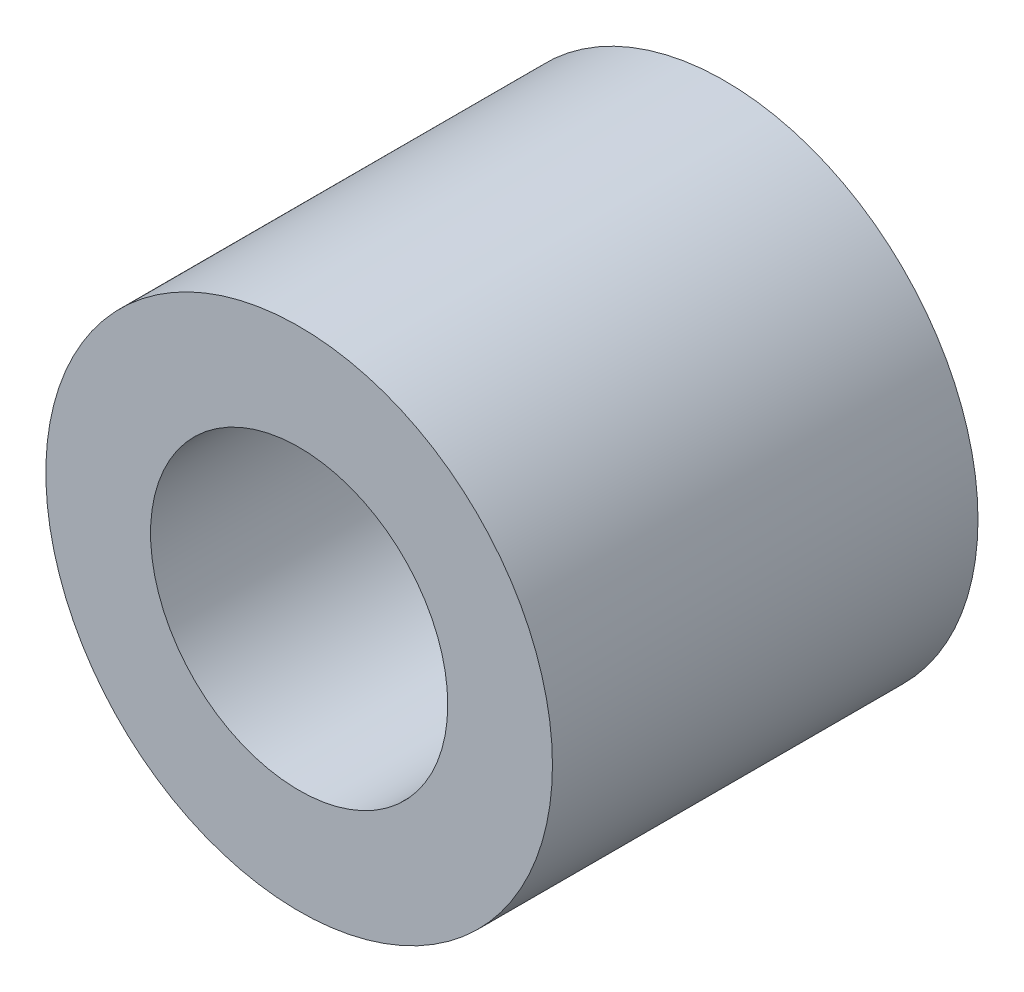
ISO-10303-21;
HEADER;
FILE_DESCRIPTION(('STEP AP214'),'2;1');
FILE_NAME('part.step','',(''),(''),'','','');
FILE_SCHEMA(('AUTOMOTIVE_DESIGN { 1 0 10303 214 1 1 1 1 }'));
ENDSEC;
DATA;
#1=APPLICATION_CONTEXT('core data for automotive mechanical design processes');
#2=APPLICATION_PROTOCOL_DEFINITION('international standard','automotive_design',2000,#1);
#3=PRODUCT_CONTEXT('',#1,'mechanical');
#4=PRODUCT('Part','Part','',(#3));
#5=PRODUCT_RELATED_PRODUCT_CATEGORY('part','',(#4));
#6=PRODUCT_DEFINITION_FORMATION('','',#4);
#7=PRODUCT_DEFINITION_CONTEXT('part definition',#1,'design');
#8=PRODUCT_DEFINITION('design','',#6,#7);
#9=PRODUCT_DEFINITION_SHAPE('','',#8);
#10=(LENGTH_UNIT() NAMED_UNIT(*) SI_UNIT(.MILLI.,.METRE.));
#11=(NAMED_UNIT(*) PLANE_ANGLE_UNIT() SI_UNIT($,.RADIAN.));
#12=(NAMED_UNIT(*) SI_UNIT($,.STERADIAN.) SOLID_ANGLE_UNIT());
#13=UNCERTAINTY_MEASURE_WITH_UNIT(LENGTH_MEASURE(1.E-05),#10,'distance_accuracy_value','');
#14=(GEOMETRIC_REPRESENTATION_CONTEXT(3) GLOBAL_UNCERTAINTY_ASSIGNED_CONTEXT((#13)) GLOBAL_UNIT_ASSIGNED_CONTEXT((#10,
#11,#12)) REPRESENTATION_CONTEXT('',''));
#15=CARTESIAN_POINT('',(0.,0.,0.));
#16=DIRECTION('',(0.,0.,1.));
#17=DIRECTION('',(1.,0.,0.));
#18=AXIS2_PLACEMENT_3D('',#15,#16,#17);
#19=CARTESIAN_POINT('',(0.,0.,8.001));
#20=DIRECTION('',(0.,0.,1.));
#21=DIRECTION('',(1.,0.,0.));
#22=AXIS2_PLACEMENT_3D('',#19,#20,#21);
#23=PLANE('',#22);
#24=CARTESIAN_POINT('',(0.,0.,8.001));
#25=DIRECTION('',(0.,0.,1.));
#26=DIRECTION('',(1.,0.,0.));
#27=AXIS2_PLACEMENT_3D('',#24,#25,#26);
#28=CIRCLE('',#27,4.7625);
#29=CARTESIAN_POINT('',(4.7625,0.,8.001));
#30=VERTEX_POINT('',#29);
#31=EDGE_CURVE('E10',#30,#30,#28,.T.);
#32=ORIENTED_EDGE('',*,*,#31,.T.);
#33=EDGE_LOOP('',(#32));
#34=FACE_BOUND('',#33,.T.);
#35=CARTESIAN_POINT('',(0.,0.,8.001));
#36=DIRECTION('',(0.,0.,1.));
#37=DIRECTION('',(1.,0.,0.));
#38=AXIS2_PLACEMENT_3D('',#35,#36,#37);
#39=CIRCLE('',#38,2.794);
#40=CARTESIAN_POINT('',(2.794,0.,8.001));
#41=VERTEX_POINT('',#40);
#42=EDGE_CURVE('E43',#41,#41,#39,.T.);
#43=ORIENTED_EDGE('',*,*,#42,.F.);
#44=EDGE_LOOP('',(#43));
#45=FACE_BOUND('',#44,.T.);
#46=ADVANCED_FACE('F32',(#34,#45),#23,.T.);
#47=CARTESIAN_POINT('',(0.,0.,0.));
#48=DIRECTION('',(0.,0.,1.));
#49=DIRECTION('',(1.,0.,0.));
#50=AXIS2_PLACEMENT_3D('',#47,#48,#49);
#51=PLANE('',#50);
#52=CARTESIAN_POINT('',(0.,0.,0.));
#53=DIRECTION('',(0.,0.,1.));
#54=DIRECTION('',(1.,0.,0.));
#55=AXIS2_PLACEMENT_3D('',#52,#53,#54);
#56=CIRCLE('',#55,4.7625);
#57=CARTESIAN_POINT('',(4.7625,0.,0.));
#58=VERTEX_POINT('',#57);
#59=EDGE_CURVE('E36',#58,#58,#56,.T.);
#60=ORIENTED_EDGE('',*,*,#59,.F.);
#61=EDGE_LOOP('',(#60));
#62=FACE_BOUND('',#61,.T.);
#63=CARTESIAN_POINT('',(0.,0.,0.));
#64=DIRECTION('',(0.,0.,1.));
#65=DIRECTION('',(1.,0.,0.));
#66=AXIS2_PLACEMENT_3D('',#63,#64,#65);
#67=CIRCLE('',#66,2.794);
#68=CARTESIAN_POINT('',(2.794,0.,0.));
#69=VERTEX_POINT('',#68);
#70=EDGE_CURVE('E45',#69,#69,#67,.T.);
#71=ORIENTED_EDGE('',*,*,#70,.T.);
#72=EDGE_LOOP('',(#71));
#73=FACE_BOUND('',#72,.T.);
#74=ADVANCED_FACE('F55',(#62,#73),#51,.F.);
#75=CARTESIAN_POINT('',(0.,0.,8.001));
#76=DIRECTION('',(0.,0.,-1.));
#77=DIRECTION('',(-1.,0.,0.));
#78=AXIS2_PLACEMENT_3D('',#75,#76,#77);
#79=CYLINDRICAL_SURFACE('',#78,4.7625);
#80=ORIENTED_EDGE('',*,*,#31,.F.);
#81=EDGE_LOOP('',(#80));
#82=FACE_BOUND('',#81,.T.);
#83=ORIENTED_EDGE('',*,*,#59,.T.);
#84=EDGE_LOOP('',(#83));
#85=FACE_BOUND('',#84,.T.);
#86=ADVANCED_FACE('F34',(#82,#85),#79,.T.);
#87=CARTESIAN_POINT('',(0.,0.,8.001));
#88=DIRECTION('',(0.,0.,-1.));
#89=DIRECTION('',(-1.,0.,0.));
#90=AXIS2_PLACEMENT_3D('',#87,#88,#89);
#91=CYLINDRICAL_SURFACE('',#90,2.794);
#92=ORIENTED_EDGE('',*,*,#42,.T.);
#93=EDGE_LOOP('',(#92));
#94=FACE_BOUND('',#93,.T.);
#95=ORIENTED_EDGE('',*,*,#70,.F.);
#96=EDGE_LOOP('',(#95));
#97=FACE_BOUND('',#96,.T.);
#98=ADVANCED_FACE('F51',(#94,#97),#91,.F.);
#99=CLOSED_SHELL('',(#46,#74,#86,#98));
#100=MANIFOLD_SOLID_BREP('B2',#99);
#101=ADVANCED_BREP_SHAPE_REPRESENTATION('',(#18,#100),#14);
#102=SHAPE_DEFINITION_REPRESENTATION(#9,#101);
ENDSEC;
END-ISO-10303-21;
